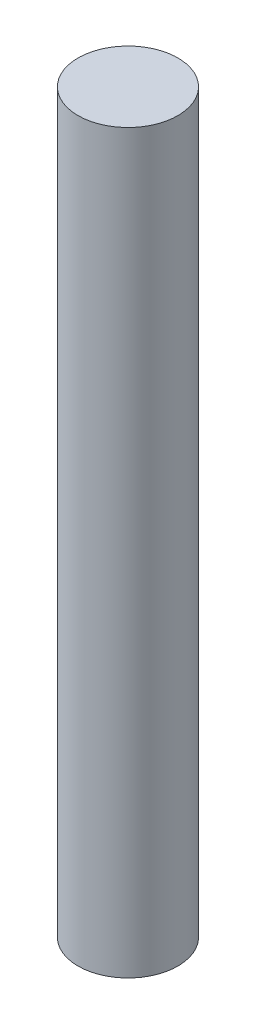
ISO-10303-21;
HEADER;
FILE_DESCRIPTION(('STEP AP214'),'2;1');
FILE_NAME('part.step','',(''),(''),'','','');
FILE_SCHEMA(('AUTOMOTIVE_DESIGN { 1 0 10303 214 1 1 1 1 }'));
ENDSEC;
DATA;
#1=APPLICATION_CONTEXT('core data for automotive mechanical design processes');
#2=APPLICATION_PROTOCOL_DEFINITION('international standard','automotive_design',2000,#1);
#3=PRODUCT_CONTEXT('',#1,'mechanical');
#4=PRODUCT('Part','Part','',(#3));
#5=PRODUCT_RELATED_PRODUCT_CATEGORY('part','',(#4));
#6=PRODUCT_DEFINITION_FORMATION('','',#4);
#7=PRODUCT_DEFINITION_CONTEXT('part definition',#1,'design');
#8=PRODUCT_DEFINITION('design','',#6,#7);
#9=PRODUCT_DEFINITION_SHAPE('','',#8);
#10=(LENGTH_UNIT() NAMED_UNIT(*) SI_UNIT(.MILLI.,.METRE.));
#11=(NAMED_UNIT(*) PLANE_ANGLE_UNIT() SI_UNIT($,.RADIAN.));
#12=(NAMED_UNIT(*) SI_UNIT($,.STERADIAN.) SOLID_ANGLE_UNIT());
#13=UNCERTAINTY_MEASURE_WITH_UNIT(LENGTH_MEASURE(1.E-05),#10,'distance_accuracy_value','');
#14=(GEOMETRIC_REPRESENTATION_CONTEXT(3) GLOBAL_UNCERTAINTY_ASSIGNED_CONTEXT((#13)) GLOBAL_UNIT_ASSIGNED_CONTEXT((#10,
#11,#12)) REPRESENTATION_CONTEXT('',''));
#15=CARTESIAN_POINT('',(0.,0.,0.));
#16=DIRECTION('',(0.,0.,1.));
#17=DIRECTION('',(1.,0.,0.));
#18=AXIS2_PLACEMENT_3D('',#15,#16,#17);
#19=CARTESIAN_POINT('',(0.,59.,0.));
#20=DIRECTION('',(0.,-1.,0.));
#21=DIRECTION('',(0.,0.,-1.));
#22=AXIS2_PLACEMENT_3D('',#19,#20,#21);
#23=CYLINDRICAL_SURFACE('',#22,4.);
#24=CARTESIAN_POINT('',(0.,59.,0.));
#25=DIRECTION('',(0.,1.,0.));
#26=DIRECTION('',(0.,0.,1.));
#27=AXIS2_PLACEMENT_3D('',#24,#25,#26);
#28=CIRCLE('',#27,4.);
#29=CARTESIAN_POINT('',(0.,59.,4.));
#30=VERTEX_POINT('',#29);
#31=EDGE_CURVE('E10',#30,#30,#28,.T.);
#32=ORIENTED_EDGE('',*,*,#31,.F.);
#33=EDGE_LOOP('',(#32));
#34=FACE_BOUND('',#33,.T.);
#35=CARTESIAN_POINT('',(0.,0.,0.));
#36=DIRECTION('',(0.,1.,0.));
#37=DIRECTION('',(0.,0.,1.));
#38=AXIS2_PLACEMENT_3D('',#35,#36,#37);
#39=CIRCLE('',#38,4.);
#40=CARTESIAN_POINT('',(0.,0.,4.));
#41=VERTEX_POINT('',#40);
#42=EDGE_CURVE('E34',#41,#41,#39,.T.);
#43=ORIENTED_EDGE('',*,*,#42,.T.);
#44=EDGE_LOOP('',(#43));
#45=FACE_BOUND('',#44,.T.);
#46=ADVANCED_FACE('F31',(#34,#45),#23,.T.);
#47=CARTESIAN_POINT('',(0.,59.,0.));
#48=DIRECTION('',(0.,1.,0.));
#49=DIRECTION('',(0.,0.,1.));
#50=AXIS2_PLACEMENT_3D('',#47,#48,#49);
#51=PLANE('',#50);
#52=ORIENTED_EDGE('',*,*,#31,.T.);
#53=EDGE_LOOP('',(#52));
#54=FACE_BOUND('',#53,.T.);
#55=ADVANCED_FACE('F46',(#54),#51,.T.);
#56=CARTESIAN_POINT('',(0.,0.,0.));
#57=DIRECTION('',(0.,1.,0.));
#58=DIRECTION('',(0.,0.,1.));
#59=AXIS2_PLACEMENT_3D('',#56,#57,#58);
#60=PLANE('',#59);
#61=ORIENTED_EDGE('',*,*,#42,.F.);
#62=EDGE_LOOP('',(#61));
#63=FACE_BOUND('',#62,.T.);
#64=ADVANCED_FACE('F44',(#63),#60,.F.);
#65=CLOSED_SHELL('',(#46,#55,#64));
#66=MANIFOLD_SOLID_BREP('B2',#65);
#67=ADVANCED_BREP_SHAPE_REPRESENTATION('',(#18,#66),#14);
#68=SHAPE_DEFINITION_REPRESENTATION(#9,#67);
ENDSEC;
END-ISO-10303-21;
